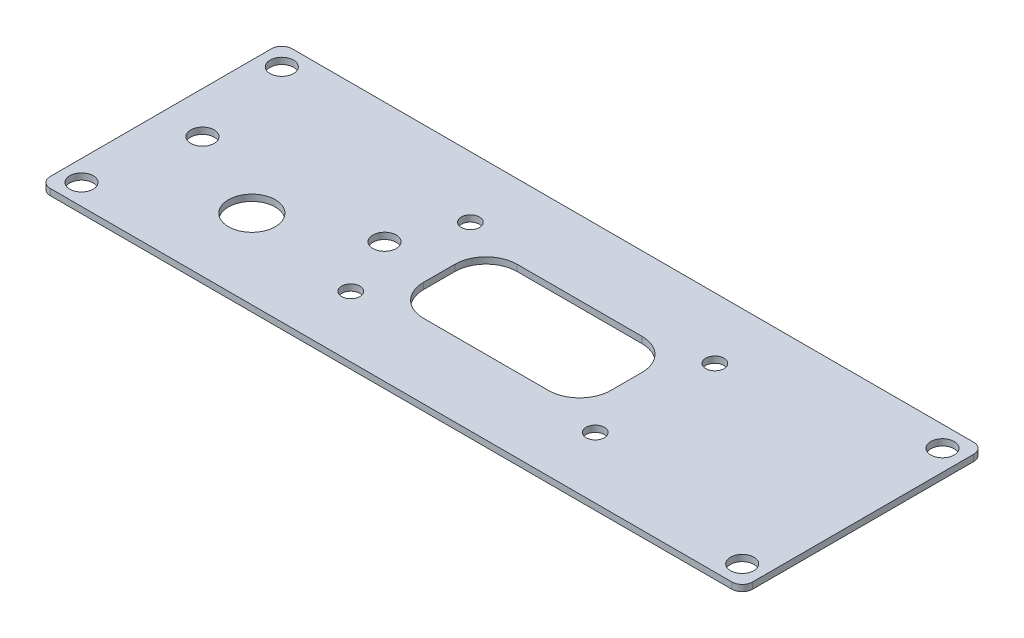
ISO-10303-21;
HEADER;
FILE_DESCRIPTION(('STEP AP214'),'2;1');
FILE_NAME('part.step','',(''),(''),'','','');
FILE_SCHEMA(('AUTOMOTIVE_DESIGN { 1 0 10303 214 1 1 1 1 }'));
ENDSEC;
DATA;
#1=APPLICATION_CONTEXT('core data for automotive mechanical design processes');
#2=APPLICATION_PROTOCOL_DEFINITION('international standard','automotive_design',2000,#1);
#3=PRODUCT_CONTEXT('',#1,'mechanical');
#4=PRODUCT('Part','Part','',(#3));
#5=PRODUCT_RELATED_PRODUCT_CATEGORY('part','',(#4));
#6=PRODUCT_DEFINITION_FORMATION('','',#4);
#7=PRODUCT_DEFINITION_CONTEXT('part definition',#1,'design');
#8=PRODUCT_DEFINITION('design','',#6,#7);
#9=PRODUCT_DEFINITION_SHAPE('','',#8);
#10=(LENGTH_UNIT() NAMED_UNIT(*) SI_UNIT(.MILLI.,.METRE.));
#11=(NAMED_UNIT(*) PLANE_ANGLE_UNIT() SI_UNIT($,.RADIAN.));
#12=(NAMED_UNIT(*) SI_UNIT($,.STERADIAN.) SOLID_ANGLE_UNIT());
#13=UNCERTAINTY_MEASURE_WITH_UNIT(LENGTH_MEASURE(1.E-05),#10,'distance_accuracy_value','');
#14=(GEOMETRIC_REPRESENTATION_CONTEXT(3) GLOBAL_UNCERTAINTY_ASSIGNED_CONTEXT((#13)) GLOBAL_UNIT_ASSIGNED_CONTEXT((#10,
#11,#12)) REPRESENTATION_CONTEXT('',''));
#15=CARTESIAN_POINT('',(0.,0.,0.));
#16=DIRECTION('',(0.,0.,1.));
#17=DIRECTION('',(1.,0.,0.));
#18=AXIS2_PLACEMENT_3D('',#15,#16,#17);
#19=CARTESIAN_POINT('',(65.5,1.2192,21.25));
#20=DIRECTION('',(0.,-1.,0.));
#21=DIRECTION('',(0.,0.,-1.));
#22=AXIS2_PLACEMENT_3D('',#19,#20,#21);
#23=PLANE('',#22);
#24=CARTESIAN_POINT('',(-42.,1.2192,8.));
#25=DIRECTION('',(0.,1.,0.));
#26=DIRECTION('',(0.,0.,1.));
#27=AXIS2_PLACEMENT_3D('',#24,#25,#26);
#28=CIRCLE('',#27,4.5);
#29=CARTESIAN_POINT('',(-42.,1.2192,12.5));
#30=VERTEX_POINT('',#29);
#31=EDGE_CURVE('E212',#30,#30,#28,.T.);
#32=ORIENTED_EDGE('',*,*,#31,.F.);
#33=EDGE_LOOP('',(#32));
#34=FACE_BOUND('',#33,.T.);
#35=CARTESIAN_POINT('',(-19.5,1.2192,11.5));
#36=DIRECTION('',(0.,1.,0.));
#37=DIRECTION('',(0.,0.,1.));
#38=AXIS2_PLACEMENT_3D('',#35,#36,#37);
#39=CIRCLE('',#38,1.75);
#40=CARTESIAN_POINT('',(-19.5,1.2192,13.25));
#41=VERTEX_POINT('',#40);
#42=EDGE_CURVE('E218',#41,#41,#39,.T.);
#43=ORIENTED_EDGE('',*,*,#42,.F.);
#44=EDGE_LOOP('',(#43));
#45=FACE_BOUND('',#44,.T.);
#46=CARTESIAN_POINT('',(27.5,1.2192,11.5));
#47=DIRECTION('',(0.,1.,0.));
#48=DIRECTION('',(0.,0.,1.));
#49=AXIS2_PLACEMENT_3D('',#46,#47,#48);
#50=CIRCLE('',#49,1.75);
#51=CARTESIAN_POINT('',(27.5,1.2192,13.25));
#52=VERTEX_POINT('',#51);
#53=EDGE_CURVE('E224',#52,#52,#50,.T.);
#54=ORIENTED_EDGE('',*,*,#53,.F.);
#55=EDGE_LOOP('',(#54));
#56=FACE_BOUND('',#55,.T.);
#57=CARTESIAN_POINT('',(-19.5,1.2192,-11.5));
#58=DIRECTION('',(0.,1.,0.));
#59=DIRECTION('',(0.,0.,1.));
#60=AXIS2_PLACEMENT_3D('',#57,#58,#59);
#61=CIRCLE('',#60,1.75);
#62=CARTESIAN_POINT('',(-19.5,1.2192,-9.75));
#63=VERTEX_POINT('',#62);
#64=EDGE_CURVE('E230',#63,#63,#61,.T.);
#65=ORIENTED_EDGE('',*,*,#64,.F.);
#66=EDGE_LOOP('',(#65));
#67=FACE_BOUND('',#66,.T.);
#68=CARTESIAN_POINT('',(27.5,1.2192,-11.5));
#69=DIRECTION('',(0.,1.,0.));
#70=DIRECTION('',(0.,0.,1.));
#71=AXIS2_PLACEMENT_3D('',#68,#69,#70);
#72=CIRCLE('',#71,1.75);
#73=CARTESIAN_POINT('',(27.5,1.2192,-9.75));
#74=VERTEX_POINT('',#73);
#75=EDGE_CURVE('E236',#74,#74,#72,.T.);
#76=ORIENTED_EDGE('',*,*,#75,.F.);
#77=EDGE_LOOP('',(#76));
#78=FACE_BOUND('',#77,.T.);
#79=CARTESIAN_POINT('',(63.5,1.2192,-19.25));
#80=DIRECTION('',(0.,1.,0.));
#81=DIRECTION('',(0.,0.,1.));
#82=AXIS2_PLACEMENT_3D('',#79,#80,#81);
#83=CIRCLE('',#82,2.25);
#84=CARTESIAN_POINT('',(63.5,1.2192,-17.));
#85=VERTEX_POINT('',#84);
#86=EDGE_CURVE('E242',#85,#85,#83,.T.);
#87=ORIENTED_EDGE('',*,*,#86,.F.);
#88=EDGE_LOOP('',(#87));
#89=FACE_BOUND('',#88,.T.);
#90=CARTESIAN_POINT('',(-63.5,1.2192,-19.25));
#91=DIRECTION('',(0.,1.,0.));
#92=DIRECTION('',(0.,0.,1.));
#93=AXIS2_PLACEMENT_3D('',#90,#91,#92);
#94=CIRCLE('',#93,2.25);
#95=CARTESIAN_POINT('',(-63.5,1.2192,-17.));
#96=VERTEX_POINT('',#95);
#97=EDGE_CURVE('E248',#96,#96,#94,.T.);
#98=ORIENTED_EDGE('',*,*,#97,.F.);
#99=EDGE_LOOP('',(#98));
#100=FACE_BOUND('',#99,.T.);
#101=CARTESIAN_POINT('',(63.5,1.2192,19.25));
#102=DIRECTION('',(0.,1.,0.));
#103=DIRECTION('',(0.,0.,1.));
#104=AXIS2_PLACEMENT_3D('',#101,#102,#103);
#105=CIRCLE('',#104,2.25);
#106=CARTESIAN_POINT('',(63.5,1.2192,21.5));
#107=VERTEX_POINT('',#106);
#108=EDGE_CURVE('E254',#107,#107,#105,.T.);
#109=ORIENTED_EDGE('',*,*,#108,.F.);
#110=EDGE_LOOP('',(#109));
#111=FACE_BOUND('',#110,.T.);
#112=CARTESIAN_POINT('',(-63.5,1.2192,19.25));
#113=DIRECTION('',(0.,1.,0.));
#114=DIRECTION('',(0.,0.,1.));
#115=AXIS2_PLACEMENT_3D('',#112,#113,#114);
#116=CIRCLE('',#115,2.25);
#117=CARTESIAN_POINT('',(-63.5,1.2192,21.5));
#118=VERTEX_POINT('',#117);
#119=EDGE_CURVE('E260',#118,#118,#116,.T.);
#120=ORIENTED_EDGE('',*,*,#119,.F.);
#121=EDGE_LOOP('',(#120));
#122=FACE_BOUND('',#121,.T.);
#123=CARTESIAN_POINT('',(-24.5,1.2192,0.));
#124=DIRECTION('',(0.,1.,0.));
#125=DIRECTION('',(0.,0.,1.));
#126=AXIS2_PLACEMENT_3D('',#123,#124,#125);
#127=CIRCLE('',#126,2.25);
#128=CARTESIAN_POINT('',(-24.5,1.2192,2.25));
#129=VERTEX_POINT('',#128);
#130=EDGE_CURVE('E266',#129,#129,#127,.T.);
#131=ORIENTED_EDGE('',*,*,#130,.F.);
#132=EDGE_LOOP('',(#131));
#133=FACE_BOUND('',#132,.T.);
#134=CARTESIAN_POINT('',(-59.5,1.2192,0.));
#135=DIRECTION('',(0.,1.,0.));
#136=DIRECTION('',(0.,0.,1.));
#137=AXIS2_PLACEMENT_3D('',#134,#135,#136);
#138=CIRCLE('',#137,2.25);
#139=CARTESIAN_POINT('',(-59.5,1.2192,2.25));
#140=VERTEX_POINT('',#139);
#141=EDGE_CURVE('E272',#140,#140,#138,.T.);
#142=ORIENTED_EDGE('',*,*,#141,.F.);
#143=EDGE_LOOP('',(#142));
#144=FACE_BOUND('',#143,.T.);
#145=CARTESIAN_POINT('',(65.5,1.2192,21.25));
#146=DIRECTION('',(0.,1.,0.));
#147=DIRECTION('',(0.,0.,-1.));
#148=AXIS2_PLACEMENT_3D('',#145,#146,#147);
#149=CIRCLE('',#148,2.);
#150=CARTESIAN_POINT('',(65.5,1.2192,23.25));
#151=VERTEX_POINT('',#150);
#152=CARTESIAN_POINT('',(67.5,1.2192,21.25));
#153=VERTEX_POINT('',#152);
#154=EDGE_CURVE('E278',#151,#153,#149,.T.);
#155=ORIENTED_EDGE('',*,*,#154,.T.);
#156=DIRECTION('',(0.,0.,-1.));
#157=VECTOR('',#156,1.);
#158=CARTESIAN_POINT('',(67.5,1.2192,21.25));
#159=LINE('',#158,#157);
#160=CARTESIAN_POINT('',(67.5,1.2192,-21.25));
#161=VERTEX_POINT('',#160);
#162=EDGE_CURVE('E281',#153,#161,#159,.T.);
#163=ORIENTED_EDGE('',*,*,#162,.T.);
#164=CARTESIAN_POINT('',(65.5,1.2192,-21.25));
#165=DIRECTION('',(0.,1.,0.));
#166=DIRECTION('',(0.,0.,-1.));
#167=AXIS2_PLACEMENT_3D('',#164,#165,#166);
#168=CIRCLE('',#167,2.);
#169=CARTESIAN_POINT('',(65.5,1.2192,-23.25));
#170=VERTEX_POINT('',#169);
#171=EDGE_CURVE('E284',#161,#170,#168,.T.);
#172=ORIENTED_EDGE('',*,*,#171,.T.);
#173=DIRECTION('',(-1.,0.,0.));
#174=VECTOR('',#173,1.);
#175=CARTESIAN_POINT('',(65.5,1.2192,-23.25));
#176=LINE('',#175,#174);
#177=CARTESIAN_POINT('',(-65.5,1.2192,-23.25));
#178=VERTEX_POINT('',#177);
#179=EDGE_CURVE('E286',#170,#178,#176,.T.);
#180=ORIENTED_EDGE('',*,*,#179,.T.);
#181=CARTESIAN_POINT('',(-65.5,1.2192,-21.25));
#182=DIRECTION('',(0.,1.,0.));
#183=DIRECTION('',(0.,0.,1.));
#184=AXIS2_PLACEMENT_3D('',#181,#182,#183);
#185=CIRCLE('',#184,2.);
#186=CARTESIAN_POINT('',(-67.5,1.2192,-21.25));
#187=VERTEX_POINT('',#186);
#188=EDGE_CURVE('E288',#178,#187,#185,.T.);
#189=ORIENTED_EDGE('',*,*,#188,.T.);
#190=DIRECTION('',(0.,0.,1.));
#191=VECTOR('',#190,1.);
#192=CARTESIAN_POINT('',(-67.5,1.2192,21.25));
#193=LINE('',#192,#191);
#194=CARTESIAN_POINT('',(-67.5,1.2192,21.25));
#195=VERTEX_POINT('',#194);
#196=EDGE_CURVE('E290',#187,#195,#193,.T.);
#197=ORIENTED_EDGE('',*,*,#196,.T.);
#198=CARTESIAN_POINT('',(-65.5,1.2192,21.25));
#199=DIRECTION('',(0.,1.,0.));
#200=DIRECTION('',(0.,0.,-1.));
#201=AXIS2_PLACEMENT_3D('',#198,#199,#200);
#202=CIRCLE('',#201,2.);
#203=CARTESIAN_POINT('',(-65.5,1.2192,23.25));
#204=VERTEX_POINT('',#203);
#205=EDGE_CURVE('E292',#195,#204,#202,.T.);
#206=ORIENTED_EDGE('',*,*,#205,.T.);
#207=DIRECTION('',(1.,0.,0.));
#208=VECTOR('',#207,1.);
#209=CARTESIAN_POINT('',(65.5,1.2192,23.25));
#210=LINE('',#209,#208);
#211=EDGE_CURVE('E294',#204,#151,#210,.T.);
#212=ORIENTED_EDGE('',*,*,#211,.T.);
#213=EDGE_LOOP('',(#155,#163,#172,#180,#189,#197,#206,#212));
#214=FACE_BOUND('',#213,.T.);
#215=CARTESIAN_POINT('',(-8.00000000000002,1.2192,-3.));
#216=DIRECTION('',(0.,1.,0.));
#217=DIRECTION('',(0.,0.,-1.));
#218=AXIS2_PLACEMENT_3D('',#215,#216,#217);
#219=CIRCLE('',#218,6.);
#220=CARTESIAN_POINT('',(-8.00000000000002,1.2192,-9.));
#221=VERTEX_POINT('',#220);
#222=CARTESIAN_POINT('',(-14.,1.2192,-3.));
#223=VERTEX_POINT('',#222);
#224=EDGE_CURVE('E147',#221,#223,#219,.T.);
#225=ORIENTED_EDGE('',*,*,#224,.F.);
#226=DIRECTION('',(-1.,0.,0.));
#227=VECTOR('',#226,1.);
#228=CARTESIAN_POINT('',(-8.00000000000002,1.2192,-9.));
#229=LINE('',#228,#227);
#230=CARTESIAN_POINT('',(16.,1.2192,-9.));
#231=VERTEX_POINT('',#230);
#232=EDGE_CURVE('E180',#231,#221,#229,.T.);
#233=ORIENTED_EDGE('',*,*,#232,.F.);
#234=CARTESIAN_POINT('',(16.,1.2192,-3.));
#235=DIRECTION('',(0.,1.,0.));
#236=DIRECTION('',(0.,0.,1.));
#237=AXIS2_PLACEMENT_3D('',#234,#235,#236);
#238=CIRCLE('',#237,6.);
#239=CARTESIAN_POINT('',(22.,1.2192,-3.));
#240=VERTEX_POINT('',#239);
#241=EDGE_CURVE('E178',#240,#231,#238,.T.);
#242=ORIENTED_EDGE('',*,*,#241,.F.);
#243=DIRECTION('',(0.,0.,-1.));
#244=VECTOR('',#243,1.);
#245=CARTESIAN_POINT('',(22.,1.2192,3.));
#246=LINE('',#245,#244);
#247=CARTESIAN_POINT('',(22.,1.2192,3.));
#248=VERTEX_POINT('',#247);
#249=EDGE_CURVE('E176',#248,#240,#246,.T.);
#250=ORIENTED_EDGE('',*,*,#249,.F.);
#251=CARTESIAN_POINT('',(16.,1.2192,3.));
#252=DIRECTION('',(0.,1.,0.));
#253=DIRECTION('',(0.,0.,1.));
#254=AXIS2_PLACEMENT_3D('',#251,#252,#253);
#255=CIRCLE('',#254,6.);
#256=CARTESIAN_POINT('',(16.,1.2192,9.));
#257=VERTEX_POINT('',#256);
#258=EDGE_CURVE('E174',#257,#248,#255,.T.);
#259=ORIENTED_EDGE('',*,*,#258,.F.);
#260=DIRECTION('',(1.,0.,0.));
#261=VECTOR('',#260,1.);
#262=CARTESIAN_POINT('',(-8.00000000000002,1.2192,9.));
#263=LINE('',#262,#261);
#264=CARTESIAN_POINT('',(-8.00000000000002,1.2192,9.));
#265=VERTEX_POINT('',#264);
#266=EDGE_CURVE('E170',#265,#257,#263,.T.);
#267=ORIENTED_EDGE('',*,*,#266,.F.);
#268=CARTESIAN_POINT('',(-8.00000000000002,1.2192,3.));
#269=DIRECTION('',(0.,1.,0.));
#270=DIRECTION('',(0.,0.,-1.));
#271=AXIS2_PLACEMENT_3D('',#268,#269,#270);
#272=CIRCLE('',#271,6.);
#273=CARTESIAN_POINT('',(-14.,1.2192,3.));
#274=VERTEX_POINT('',#273);
#275=EDGE_CURVE('E168',#274,#265,#272,.T.);
#276=ORIENTED_EDGE('',*,*,#275,.F.);
#277=DIRECTION('',(0.,0.,1.));
#278=VECTOR('',#277,1.);
#279=CARTESIAN_POINT('',(-14.,1.2192,3.));
#280=LINE('',#279,#278);
#281=EDGE_CURVE('E155',#223,#274,#280,.T.);
#282=ORIENTED_EDGE('',*,*,#281,.F.);
#283=EDGE_LOOP('',(#225,#233,#242,#250,#259,#267,#276,#282));
#284=FACE_BOUND('',#283,.T.);
#285=ADVANCED_FACE('F34',(#34,#45,#56,#67,#78,#89,#100,#111,#122,#133,#144,#214,#284),#23,.F.);
#286=CARTESIAN_POINT('',(65.5,0.,21.25));
#287=DIRECTION('',(0.,-1.,0.));
#288=DIRECTION('',(0.,0.,-1.));
#289=AXIS2_PLACEMENT_3D('',#286,#287,#288);
#290=PLANE('',#289);
#291=CARTESIAN_POINT('',(-19.5,0.,11.5));
#292=DIRECTION('',(0.,1.,0.));
#293=DIRECTION('',(0.,0.,1.));
#294=AXIS2_PLACEMENT_3D('',#291,#292,#293);
#295=CIRCLE('',#294,1.75);
#296=CARTESIAN_POINT('',(-19.5,0.,13.25));
#297=VERTEX_POINT('',#296);
#298=EDGE_CURVE('E215',#297,#297,#295,.T.);
#299=ORIENTED_EDGE('',*,*,#298,.T.);
#300=EDGE_LOOP('',(#299));
#301=FACE_BOUND('',#300,.T.);
#302=CARTESIAN_POINT('',(-19.5,0.,-11.5));
#303=DIRECTION('',(0.,1.,0.));
#304=DIRECTION('',(0.,0.,1.));
#305=AXIS2_PLACEMENT_3D('',#302,#303,#304);
#306=CIRCLE('',#305,1.75);
#307=CARTESIAN_POINT('',(-19.5,0.,-9.75));
#308=VERTEX_POINT('',#307);
#309=EDGE_CURVE('E227',#308,#308,#306,.T.);
#310=ORIENTED_EDGE('',*,*,#309,.T.);
#311=EDGE_LOOP('',(#310));
#312=FACE_BOUND('',#311,.T.);
#313=CARTESIAN_POINT('',(63.5,0.,-19.25));
#314=DIRECTION('',(0.,1.,0.));
#315=DIRECTION('',(0.,0.,1.));
#316=AXIS2_PLACEMENT_3D('',#313,#314,#315);
#317=CIRCLE('',#316,2.25);
#318=CARTESIAN_POINT('',(63.5,0.,-17.));
#319=VERTEX_POINT('',#318);
#320=EDGE_CURVE('E239',#319,#319,#317,.T.);
#321=ORIENTED_EDGE('',*,*,#320,.T.);
#322=EDGE_LOOP('',(#321));
#323=FACE_BOUND('',#322,.T.);
#324=CARTESIAN_POINT('',(63.5,0.,19.25));
#325=DIRECTION('',(0.,1.,0.));
#326=DIRECTION('',(0.,0.,1.));
#327=AXIS2_PLACEMENT_3D('',#324,#325,#326);
#328=CIRCLE('',#327,2.25);
#329=CARTESIAN_POINT('',(63.5,0.,21.5));
#330=VERTEX_POINT('',#329);
#331=EDGE_CURVE('E251',#330,#330,#328,.T.);
#332=ORIENTED_EDGE('',*,*,#331,.T.);
#333=EDGE_LOOP('',(#332));
#334=FACE_BOUND('',#333,.T.);
#335=CARTESIAN_POINT('',(-24.5,0.,0.));
#336=DIRECTION('',(0.,1.,0.));
#337=DIRECTION('',(0.,0.,1.));
#338=AXIS2_PLACEMENT_3D('',#335,#336,#337);
#339=CIRCLE('',#338,2.25);
#340=CARTESIAN_POINT('',(-24.5,0.,2.25));
#341=VERTEX_POINT('',#340);
#342=EDGE_CURVE('E263',#341,#341,#339,.T.);
#343=ORIENTED_EDGE('',*,*,#342,.T.);
#344=EDGE_LOOP('',(#343));
#345=FACE_BOUND('',#344,.T.);
#346=CARTESIAN_POINT('',(65.5,0.,21.25));
#347=DIRECTION('',(0.,1.,0.));
#348=DIRECTION('',(0.,0.,-1.));
#349=AXIS2_PLACEMENT_3D('',#346,#347,#348);
#350=CIRCLE('',#349,2.);
#351=CARTESIAN_POINT('',(65.5,0.,23.25));
#352=VERTEX_POINT('',#351);
#353=CARTESIAN_POINT('',(67.5,0.,21.25));
#354=VERTEX_POINT('',#353);
#355=EDGE_CURVE('E275',#352,#354,#350,.T.);
#356=ORIENTED_EDGE('',*,*,#355,.F.);
#357=DIRECTION('',(1.,0.,0.));
#358=VECTOR('',#357,1.);
#359=CARTESIAN_POINT('',(65.5,0.,23.25));
#360=LINE('',#359,#358);
#361=CARTESIAN_POINT('',(-65.5,0.,23.25));
#362=VERTEX_POINT('',#361);
#363=EDGE_CURVE('E282',#362,#352,#360,.T.);
#364=ORIENTED_EDGE('',*,*,#363,.F.);
#365=CARTESIAN_POINT('',(-65.5,0.,21.25));
#366=DIRECTION('',(0.,1.,0.));
#367=DIRECTION('',(0.,0.,-1.));
#368=AXIS2_PLACEMENT_3D('',#365,#366,#367);
#369=CIRCLE('',#368,2.);
#370=CARTESIAN_POINT('',(-67.5,0.,21.25));
#371=VERTEX_POINT('',#370);
#372=EDGE_CURVE('E309',#371,#362,#369,.T.);
#373=ORIENTED_EDGE('',*,*,#372,.F.);
#374=DIRECTION('',(0.,0.,1.));
#375=VECTOR('',#374,1.);
#376=CARTESIAN_POINT('',(-67.5,0.,21.25));
#377=LINE('',#376,#375);
#378=CARTESIAN_POINT('',(-67.5,0.,-21.25));
#379=VERTEX_POINT('',#378);
#380=EDGE_CURVE('E307',#379,#371,#377,.T.);
#381=ORIENTED_EDGE('',*,*,#380,.F.);
#382=CARTESIAN_POINT('',(-65.5,0.,-21.25));
#383=DIRECTION('',(0.,1.,0.));
#384=DIRECTION('',(0.,0.,1.));
#385=AXIS2_PLACEMENT_3D('',#382,#383,#384);
#386=CIRCLE('',#385,2.);
#387=CARTESIAN_POINT('',(-65.5,0.,-23.25));
#388=VERTEX_POINT('',#387);
#389=EDGE_CURVE('E305',#388,#379,#386,.T.);
#390=ORIENTED_EDGE('',*,*,#389,.F.);
#391=DIRECTION('',(-1.,0.,0.));
#392=VECTOR('',#391,1.);
#393=CARTESIAN_POINT('',(65.5,0.,-23.25));
#394=LINE('',#393,#392);
#395=CARTESIAN_POINT('',(65.5,0.,-23.25));
#396=VERTEX_POINT('',#395);
#397=EDGE_CURVE('E303',#396,#388,#394,.T.);
#398=ORIENTED_EDGE('',*,*,#397,.F.);
#399=CARTESIAN_POINT('',(65.5,0.,-21.25));
#400=DIRECTION('',(0.,1.,0.));
#401=DIRECTION('',(0.,0.,-1.));
#402=AXIS2_PLACEMENT_3D('',#399,#400,#401);
#403=CIRCLE('',#402,2.);
#404=CARTESIAN_POINT('',(67.5,0.,-21.25));
#405=VERTEX_POINT('',#404);
#406=EDGE_CURVE('E301',#405,#396,#403,.T.);
#407=ORIENTED_EDGE('',*,*,#406,.F.);
#408=DIRECTION('',(0.,0.,-1.));
#409=VECTOR('',#408,1.);
#410=CARTESIAN_POINT('',(67.5,0.,21.25));
#411=LINE('',#410,#409);
#412=EDGE_CURVE('E299',#354,#405,#411,.T.);
#413=ORIENTED_EDGE('',*,*,#412,.F.);
#414=EDGE_LOOP('',(#356,#364,#373,#381,#390,#398,#407,#413));
#415=FACE_BOUND('',#414,.T.);
#416=CARTESIAN_POINT('',(-59.5,0.,0.));
#417=DIRECTION('',(0.,1.,0.));
#418=DIRECTION('',(0.,0.,1.));
#419=AXIS2_PLACEMENT_3D('',#416,#417,#418);
#420=CIRCLE('',#419,2.25);
#421=CARTESIAN_POINT('',(-59.5,0.,2.25));
#422=VERTEX_POINT('',#421);
#423=EDGE_CURVE('E269',#422,#422,#420,.T.);
#424=ORIENTED_EDGE('',*,*,#423,.T.);
#425=EDGE_LOOP('',(#424));
#426=FACE_BOUND('',#425,.T.);
#427=CARTESIAN_POINT('',(-63.5,0.,19.25));
#428=DIRECTION('',(0.,1.,0.));
#429=DIRECTION('',(0.,0.,1.));
#430=AXIS2_PLACEMENT_3D('',#427,#428,#429);
#431=CIRCLE('',#430,2.25);
#432=CARTESIAN_POINT('',(-63.5,0.,21.5));
#433=VERTEX_POINT('',#432);
#434=EDGE_CURVE('E257',#433,#433,#431,.T.);
#435=ORIENTED_EDGE('',*,*,#434,.T.);
#436=EDGE_LOOP('',(#435));
#437=FACE_BOUND('',#436,.T.);
#438=CARTESIAN_POINT('',(-63.5,0.,-19.25));
#439=DIRECTION('',(0.,1.,0.));
#440=DIRECTION('',(0.,0.,1.));
#441=AXIS2_PLACEMENT_3D('',#438,#439,#440);
#442=CIRCLE('',#441,2.25);
#443=CARTESIAN_POINT('',(-63.5,0.,-17.));
#444=VERTEX_POINT('',#443);
#445=EDGE_CURVE('E245',#444,#444,#442,.T.);
#446=ORIENTED_EDGE('',*,*,#445,.T.);
#447=EDGE_LOOP('',(#446));
#448=FACE_BOUND('',#447,.T.);
#449=CARTESIAN_POINT('',(27.5,0.,-11.5));
#450=DIRECTION('',(0.,1.,0.));
#451=DIRECTION('',(0.,0.,1.));
#452=AXIS2_PLACEMENT_3D('',#449,#450,#451);
#453=CIRCLE('',#452,1.75);
#454=CARTESIAN_POINT('',(27.5,0.,-9.75));
#455=VERTEX_POINT('',#454);
#456=EDGE_CURVE('E233',#455,#455,#453,.T.);
#457=ORIENTED_EDGE('',*,*,#456,.T.);
#458=EDGE_LOOP('',(#457));
#459=FACE_BOUND('',#458,.T.);
#460=CARTESIAN_POINT('',(27.5,0.,11.5));
#461=DIRECTION('',(0.,1.,0.));
#462=DIRECTION('',(0.,0.,1.));
#463=AXIS2_PLACEMENT_3D('',#460,#461,#462);
#464=CIRCLE('',#463,1.75);
#465=CARTESIAN_POINT('',(27.5,0.,13.25));
#466=VERTEX_POINT('',#465);
#467=EDGE_CURVE('E221',#466,#466,#464,.T.);
#468=ORIENTED_EDGE('',*,*,#467,.T.);
#469=EDGE_LOOP('',(#468));
#470=FACE_BOUND('',#469,.T.);
#471=CARTESIAN_POINT('',(-42.,0.,8.));
#472=DIRECTION('',(0.,1.,0.));
#473=DIRECTION('',(0.,0.,1.));
#474=AXIS2_PLACEMENT_3D('',#471,#472,#473);
#475=CIRCLE('',#474,4.5);
#476=CARTESIAN_POINT('',(-42.,0.,12.5));
#477=VERTEX_POINT('',#476);
#478=EDGE_CURVE('E163',#477,#477,#475,.T.);
#479=ORIENTED_EDGE('',*,*,#478,.T.);
#480=EDGE_LOOP('',(#479));
#481=FACE_BOUND('',#480,.T.);
#482=DIRECTION('',(-1.,0.,0.));
#483=VECTOR('',#482,1.);
#484=CARTESIAN_POINT('',(-8.00000000000002,0.,-9.));
#485=LINE('',#484,#483);
#486=CARTESIAN_POINT('',(16.,0.,-9.));
#487=VERTEX_POINT('',#486);
#488=CARTESIAN_POINT('',(-8.00000000000001,0.,-9.));
#489=VERTEX_POINT('',#488);
#490=EDGE_CURVE('E156',#487,#489,#485,.T.);
#491=ORIENTED_EDGE('',*,*,#490,.T.);
#492=CARTESIAN_POINT('',(-8.00000000000002,0.,-3.));
#493=DIRECTION('',(0.,1.,0.));
#494=DIRECTION('',(0.,0.,-1.));
#495=AXIS2_PLACEMENT_3D('',#492,#493,#494);
#496=CIRCLE('',#495,6.);
#497=CARTESIAN_POINT('',(-14.,0.,-3.));
#498=VERTEX_POINT('',#497);
#499=EDGE_CURVE('E57',#489,#498,#496,.T.);
#500=ORIENTED_EDGE('',*,*,#499,.T.);
#501=DIRECTION('',(0.,0.,1.));
#502=VECTOR('',#501,1.);
#503=CARTESIAN_POINT('',(-14.,0.,3.));
#504=LINE('',#503,#502);
#505=CARTESIAN_POINT('',(-14.,0.,3.));
#506=VERTEX_POINT('',#505);
#507=EDGE_CURVE('E162',#498,#506,#504,.T.);
#508=ORIENTED_EDGE('',*,*,#507,.T.);
#509=CARTESIAN_POINT('',(-8.00000000000002,0.,3.));
#510=DIRECTION('',(0.,1.,0.));
#511=DIRECTION('',(0.,0.,-1.));
#512=AXIS2_PLACEMENT_3D('',#509,#510,#511);
#513=CIRCLE('',#512,6.);
#514=CARTESIAN_POINT('',(-8.00000000000002,0.,9.));
#515=VERTEX_POINT('',#514);
#516=EDGE_CURVE('E184',#506,#515,#513,.T.);
#517=ORIENTED_EDGE('',*,*,#516,.T.);
#518=DIRECTION('',(1.,0.,0.));
#519=VECTOR('',#518,1.);
#520=CARTESIAN_POINT('',(-8.00000000000002,0.,9.));
#521=LINE('',#520,#519);
#522=CARTESIAN_POINT('',(16.,0.,9.));
#523=VERTEX_POINT('',#522);
#524=EDGE_CURVE('E187',#515,#523,#521,.T.);
#525=ORIENTED_EDGE('',*,*,#524,.T.);
#526=CARTESIAN_POINT('',(16.,0.,3.));
#527=DIRECTION('',(0.,1.,0.));
#528=DIRECTION('',(0.,0.,1.));
#529=AXIS2_PLACEMENT_3D('',#526,#527,#528);
#530=CIRCLE('',#529,6.);
#531=CARTESIAN_POINT('',(22.,0.,3.));
#532=VERTEX_POINT('',#531);
#533=EDGE_CURVE('E190',#523,#532,#530,.T.);
#534=ORIENTED_EDGE('',*,*,#533,.T.);
#535=DIRECTION('',(0.,0.,-1.));
#536=VECTOR('',#535,1.);
#537=CARTESIAN_POINT('',(22.,0.,3.));
#538=LINE('',#537,#536);
#539=CARTESIAN_POINT('',(22.,0.,-3.));
#540=VERTEX_POINT('',#539);
#541=EDGE_CURVE('E193',#532,#540,#538,.T.);
#542=ORIENTED_EDGE('',*,*,#541,.T.);
#543=CARTESIAN_POINT('',(16.,0.,-3.));
#544=DIRECTION('',(0.,1.,0.));
#545=DIRECTION('',(0.,0.,1.));
#546=AXIS2_PLACEMENT_3D('',#543,#544,#545);
#547=CIRCLE('',#546,6.);
#548=EDGE_CURVE('E196',#540,#487,#547,.T.);
#549=ORIENTED_EDGE('',*,*,#548,.T.);
#550=EDGE_LOOP('',(#491,#500,#508,#517,#525,#534,#542,#549));
#551=FACE_BOUND('',#550,.T.);
#552=ADVANCED_FACE('F339',(#301,#312,#323,#334,#345,#415,#426,#437,#448,#459,#470,#481,#551),
#290,.T.);
#553=CARTESIAN_POINT('',(65.5,1.2192,21.25));
#554=DIRECTION('',(0.,-1.,0.));
#555=DIRECTION('',(0.,0.,-1.));
#556=AXIS2_PLACEMENT_3D('',#553,#554,#555);
#557=CYLINDRICAL_SURFACE('',#556,2.);
#558=ORIENTED_EDGE('',*,*,#355,.T.);
#559=DIRECTION('',(0.,-1.,0.));
#560=VECTOR('',#559,1.);
#561=CARTESIAN_POINT('',(67.5,1.2192,21.25));
#562=LINE('',#561,#560);
#563=EDGE_CURVE('E11',#153,#354,#562,.T.);
#564=ORIENTED_EDGE('',*,*,#563,.F.);
#565=ORIENTED_EDGE('',*,*,#154,.F.);
#566=DIRECTION('',(0.,-1.,0.));
#567=VECTOR('',#566,1.);
#568=CARTESIAN_POINT('',(65.5,1.2192,23.25));
#569=LINE('',#568,#567);
#570=EDGE_CURVE('E296',#151,#352,#569,.T.);
#571=ORIENTED_EDGE('',*,*,#570,.T.);
#572=EDGE_LOOP('',(#558,#564,#565,#571));
#573=FACE_BOUND('',#572,.T.);
#574=ADVANCED_FACE('F36',(#573),#557,.T.);
#575=CARTESIAN_POINT('',(67.5,1.2192,21.25));
#576=DIRECTION('',(-1.,0.,0.));
#577=DIRECTION('',(0.,0.,1.));
#578=AXIS2_PLACEMENT_3D('',#575,#576,#577);
#579=PLANE('',#578);
#580=ORIENTED_EDGE('',*,*,#412,.T.);
#581=DIRECTION('',(0.,-1.,0.));
#582=VECTOR('',#581,1.);
#583=CARTESIAN_POINT('',(67.5,1.2192,-21.25));
#584=LINE('',#583,#582);
#585=EDGE_CURVE('E42',#161,#405,#584,.T.);
#586=ORIENTED_EDGE('',*,*,#585,.F.);
#587=ORIENTED_EDGE('',*,*,#162,.F.);
#588=ORIENTED_EDGE('',*,*,#563,.T.);
#589=EDGE_LOOP('',(#580,#586,#587,#588));
#590=FACE_BOUND('',#589,.T.);
#591=ADVANCED_FACE('F356',(#590),#579,.F.);
#592=CARTESIAN_POINT('',(65.5,1.2192,-21.25));
#593=DIRECTION('',(0.,-1.,0.));
#594=DIRECTION('',(0.,0.,-1.));
#595=AXIS2_PLACEMENT_3D('',#592,#593,#594);
#596=CYLINDRICAL_SURFACE('',#595,2.);
#597=ORIENTED_EDGE('',*,*,#406,.T.);
#598=DIRECTION('',(0.,-1.,0.));
#599=VECTOR('',#598,1.);
#600=CARTESIAN_POINT('',(65.5,1.2192,-23.25));
#601=LINE('',#600,#599);
#602=EDGE_CURVE('E326',#170,#396,#601,.T.);
#603=ORIENTED_EDGE('',*,*,#602,.F.);
#604=ORIENTED_EDGE('',*,*,#171,.F.);
#605=ORIENTED_EDGE('',*,*,#585,.T.);
#606=EDGE_LOOP('',(#597,#603,#604,#605));
#607=FACE_BOUND('',#606,.T.);
#608=ADVANCED_FACE('F333',(#607),#596,.T.);
#609=CARTESIAN_POINT('',(65.5,1.2192,-23.25));
#610=DIRECTION('',(0.,0.,1.));
#611=DIRECTION('',(1.,0.,0.));
#612=AXIS2_PLACEMENT_3D('',#609,#610,#611);
#613=PLANE('',#612);
#614=ORIENTED_EDGE('',*,*,#397,.T.);
#615=DIRECTION('',(0.,-1.,0.));
#616=VECTOR('',#615,1.);
#617=CARTESIAN_POINT('',(-65.5,1.2192,-23.25));
#618=LINE('',#617,#616);
#619=EDGE_CURVE('E323',#178,#388,#618,.T.);
#620=ORIENTED_EDGE('',*,*,#619,.F.);
#621=ORIENTED_EDGE('',*,*,#179,.F.);
#622=ORIENTED_EDGE('',*,*,#602,.T.);
#623=EDGE_LOOP('',(#614,#620,#621,#622));
#624=FACE_BOUND('',#623,.T.);
#625=ADVANCED_FACE('F345',(#624),#613,.F.);
#626=CARTESIAN_POINT('',(-65.5,1.2192,-21.25));
#627=DIRECTION('',(0.,-1.,0.));
#628=DIRECTION('',(0.,0.,-1.));
#629=AXIS2_PLACEMENT_3D('',#626,#627,#628);
#630=CYLINDRICAL_SURFACE('',#629,2.);
#631=ORIENTED_EDGE('',*,*,#389,.T.);
#632=DIRECTION('',(0.,-1.,0.));
#633=VECTOR('',#632,1.);
#634=CARTESIAN_POINT('',(-67.5,1.2192,-21.25));
#635=LINE('',#634,#633);
#636=EDGE_CURVE('E320',#187,#379,#635,.T.);
#637=ORIENTED_EDGE('',*,*,#636,.F.);
#638=ORIENTED_EDGE('',*,*,#188,.F.);
#639=ORIENTED_EDGE('',*,*,#619,.T.);
#640=EDGE_LOOP('',(#631,#637,#638,#639));
#641=FACE_BOUND('',#640,.T.);
#642=ADVANCED_FACE('F349',(#641),#630,.T.);
#643=CARTESIAN_POINT('',(-67.5,1.2192,21.25));
#644=DIRECTION('',(1.,0.,0.));
#645=DIRECTION('',(0.,0.,-1.));
#646=AXIS2_PLACEMENT_3D('',#643,#644,#645);
#647=PLANE('',#646);
#648=ORIENTED_EDGE('',*,*,#380,.T.);
#649=DIRECTION('',(0.,-1.,0.));
#650=VECTOR('',#649,1.);
#651=CARTESIAN_POINT('',(-67.5,1.2192,21.25));
#652=LINE('',#651,#650);
#653=EDGE_CURVE('E317',#195,#371,#652,.T.);
#654=ORIENTED_EDGE('',*,*,#653,.F.);
#655=ORIENTED_EDGE('',*,*,#196,.F.);
#656=ORIENTED_EDGE('',*,*,#636,.T.);
#657=EDGE_LOOP('',(#648,#654,#655,#656));
#658=FACE_BOUND('',#657,.T.);
#659=ADVANCED_FACE('F369',(#658),#647,.F.);
#660=CARTESIAN_POINT('',(-65.5,1.2192,21.25));
#661=DIRECTION('',(0.,-1.,0.));
#662=DIRECTION('',(0.,0.,-1.));
#663=AXIS2_PLACEMENT_3D('',#660,#661,#662);
#664=CYLINDRICAL_SURFACE('',#663,2.);
#665=ORIENTED_EDGE('',*,*,#372,.T.);
#666=DIRECTION('',(0.,-1.,0.));
#667=VECTOR('',#666,1.);
#668=CARTESIAN_POINT('',(-65.5,1.2192,23.25));
#669=LINE('',#668,#667);
#670=EDGE_CURVE('E314',#204,#362,#669,.T.);
#671=ORIENTED_EDGE('',*,*,#670,.F.);
#672=ORIENTED_EDGE('',*,*,#205,.F.);
#673=ORIENTED_EDGE('',*,*,#653,.T.);
#674=EDGE_LOOP('',(#665,#671,#672,#673));
#675=FACE_BOUND('',#674,.T.);
#676=ADVANCED_FACE('F367',(#675),#664,.T.);
#677=CARTESIAN_POINT('',(65.5,1.2192,23.25));
#678=DIRECTION('',(0.,0.,-1.));
#679=DIRECTION('',(-1.,0.,0.));
#680=AXIS2_PLACEMENT_3D('',#677,#678,#679);
#681=PLANE('',#680);
#682=ORIENTED_EDGE('',*,*,#363,.T.);
#683=ORIENTED_EDGE('',*,*,#570,.F.);
#684=ORIENTED_EDGE('',*,*,#211,.F.);
#685=ORIENTED_EDGE('',*,*,#670,.T.);
#686=EDGE_LOOP('',(#682,#683,#684,#685));
#687=FACE_BOUND('',#686,.T.);
#688=ADVANCED_FACE('F362',(#687),#681,.F.);
#689=CARTESIAN_POINT('',(-59.5,1.2192,0.));
#690=DIRECTION('',(0.,-1.,0.));
#691=DIRECTION('',(0.,0.,-1.));
#692=AXIS2_PLACEMENT_3D('',#689,#690,#691);
#693=CYLINDRICAL_SURFACE('',#692,2.25);
#694=ORIENTED_EDGE('',*,*,#141,.T.);
#695=EDGE_LOOP('',(#694));
#696=FACE_BOUND('',#695,.T.);
#697=ORIENTED_EDGE('',*,*,#423,.F.);
#698=EDGE_LOOP('',(#697));
#699=FACE_BOUND('',#698,.T.);
#700=ADVANCED_FACE('F389',(#696,#699),#693,.F.);
#701=CARTESIAN_POINT('',(-24.5,1.2192,0.));
#702=DIRECTION('',(0.,-1.,0.));
#703=DIRECTION('',(0.,0.,-1.));
#704=AXIS2_PLACEMENT_3D('',#701,#702,#703);
#705=CYLINDRICAL_SURFACE('',#704,2.25);
#706=ORIENTED_EDGE('',*,*,#130,.T.);
#707=EDGE_LOOP('',(#706));
#708=FACE_BOUND('',#707,.T.);
#709=ORIENTED_EDGE('',*,*,#342,.F.);
#710=EDGE_LOOP('',(#709));
#711=FACE_BOUND('',#710,.T.);
#712=ADVANCED_FACE('F396',(#708,#711),#705,.F.);
#713=CARTESIAN_POINT('',(-63.5,1.2192,19.25));
#714=DIRECTION('',(0.,-1.,0.));
#715=DIRECTION('',(0.,0.,-1.));
#716=AXIS2_PLACEMENT_3D('',#713,#714,#715);
#717=CYLINDRICAL_SURFACE('',#716,2.25);
#718=ORIENTED_EDGE('',*,*,#119,.T.);
#719=EDGE_LOOP('',(#718));
#720=FACE_BOUND('',#719,.T.);
#721=ORIENTED_EDGE('',*,*,#434,.F.);
#722=EDGE_LOOP('',(#721));
#723=FACE_BOUND('',#722,.T.);
#724=ADVANCED_FACE('F401',(#720,#723),#717,.F.);
#725=CARTESIAN_POINT('',(63.5,1.2192,19.25));
#726=DIRECTION('',(0.,-1.,0.));
#727=DIRECTION('',(0.,0.,-1.));
#728=AXIS2_PLACEMENT_3D('',#725,#726,#727);
#729=CYLINDRICAL_SURFACE('',#728,2.25);
#730=ORIENTED_EDGE('',*,*,#108,.T.);
#731=EDGE_LOOP('',(#730));
#732=FACE_BOUND('',#731,.T.);
#733=ORIENTED_EDGE('',*,*,#331,.F.);
#734=EDGE_LOOP('',(#733));
#735=FACE_BOUND('',#734,.T.);
#736=ADVANCED_FACE('F479',(#732,#735),#729,.F.);
#737=CARTESIAN_POINT('',(-63.5,1.2192,-19.25));
#738=DIRECTION('',(0.,-1.,0.));
#739=DIRECTION('',(0.,0.,-1.));
#740=AXIS2_PLACEMENT_3D('',#737,#738,#739);
#741=CYLINDRICAL_SURFACE('',#740,2.25);
#742=ORIENTED_EDGE('',*,*,#97,.T.);
#743=EDGE_LOOP('',(#742));
#744=FACE_BOUND('',#743,.T.);
#745=ORIENTED_EDGE('',*,*,#445,.F.);
#746=EDGE_LOOP('',(#745));
#747=FACE_BOUND('',#746,.T.);
#748=ADVANCED_FACE('F475',(#744,#747),#741,.F.);
#749=CARTESIAN_POINT('',(63.5,1.2192,-19.25));
#750=DIRECTION('',(0.,-1.,0.));
#751=DIRECTION('',(0.,0.,-1.));
#752=AXIS2_PLACEMENT_3D('',#749,#750,#751);
#753=CYLINDRICAL_SURFACE('',#752,2.25);
#754=ORIENTED_EDGE('',*,*,#86,.T.);
#755=EDGE_LOOP('',(#754));
#756=FACE_BOUND('',#755,.T.);
#757=ORIENTED_EDGE('',*,*,#320,.F.);
#758=EDGE_LOOP('',(#757));
#759=FACE_BOUND('',#758,.T.);
#760=ADVANCED_FACE('F471',(#756,#759),#753,.F.);
#761=CARTESIAN_POINT('',(27.5,1.2192,-11.5));
#762=DIRECTION('',(0.,-1.,0.));
#763=DIRECTION('',(0.,0.,-1.));
#764=AXIS2_PLACEMENT_3D('',#761,#762,#763);
#765=CYLINDRICAL_SURFACE('',#764,1.75);
#766=ORIENTED_EDGE('',*,*,#75,.T.);
#767=EDGE_LOOP('',(#766));
#768=FACE_BOUND('',#767,.T.);
#769=ORIENTED_EDGE('',*,*,#456,.F.);
#770=EDGE_LOOP('',(#769));
#771=FACE_BOUND('',#770,.T.);
#772=ADVANCED_FACE('F467',(#768,#771),#765,.F.);
#773=CARTESIAN_POINT('',(-19.5,1.2192,-11.5));
#774=DIRECTION('',(0.,-1.,0.));
#775=DIRECTION('',(0.,0.,-1.));
#776=AXIS2_PLACEMENT_3D('',#773,#774,#775);
#777=CYLINDRICAL_SURFACE('',#776,1.75);
#778=ORIENTED_EDGE('',*,*,#64,.T.);
#779=EDGE_LOOP('',(#778));
#780=FACE_BOUND('',#779,.T.);
#781=ORIENTED_EDGE('',*,*,#309,.F.);
#782=EDGE_LOOP('',(#781));
#783=FACE_BOUND('',#782,.T.);
#784=ADVANCED_FACE('F463',(#780,#783),#777,.F.);
#785=CARTESIAN_POINT('',(27.5,1.2192,11.5));
#786=DIRECTION('',(0.,-1.,0.));
#787=DIRECTION('',(0.,0.,-1.));
#788=AXIS2_PLACEMENT_3D('',#785,#786,#787);
#789=CYLINDRICAL_SURFACE('',#788,1.75);
#790=ORIENTED_EDGE('',*,*,#53,.T.);
#791=EDGE_LOOP('',(#790));
#792=FACE_BOUND('',#791,.T.);
#793=ORIENTED_EDGE('',*,*,#467,.F.);
#794=EDGE_LOOP('',(#793));
#795=FACE_BOUND('',#794,.T.);
#796=ADVANCED_FACE('F459',(#792,#795),#789,.F.);
#797=CARTESIAN_POINT('',(-19.5,1.2192,11.5));
#798=DIRECTION('',(0.,-1.,0.));
#799=DIRECTION('',(0.,0.,-1.));
#800=AXIS2_PLACEMENT_3D('',#797,#798,#799);
#801=CYLINDRICAL_SURFACE('',#800,1.75);
#802=ORIENTED_EDGE('',*,*,#42,.T.);
#803=EDGE_LOOP('',(#802));
#804=FACE_BOUND('',#803,.T.);
#805=ORIENTED_EDGE('',*,*,#298,.F.);
#806=EDGE_LOOP('',(#805));
#807=FACE_BOUND('',#806,.T.);
#808=ADVANCED_FACE('F455',(#804,#807),#801,.F.);
#809=CARTESIAN_POINT('',(-42.,1.2192,8.));
#810=DIRECTION('',(0.,-1.,0.));
#811=DIRECTION('',(0.,0.,-1.));
#812=AXIS2_PLACEMENT_3D('',#809,#810,#811);
#813=CYLINDRICAL_SURFACE('',#812,4.5);
#814=ORIENTED_EDGE('',*,*,#31,.T.);
#815=EDGE_LOOP('',(#814));
#816=FACE_BOUND('',#815,.T.);
#817=ORIENTED_EDGE('',*,*,#478,.F.);
#818=EDGE_LOOP('',(#817));
#819=FACE_BOUND('',#818,.T.);
#820=ADVANCED_FACE('F452',(#816,#819),#813,.F.);
#821=CARTESIAN_POINT('',(-8.00000000000002,1.2192,-3.));
#822=DIRECTION('',(0.,-1.,0.));
#823=DIRECTION('',(0.,0.,-1.));
#824=AXIS2_PLACEMENT_3D('',#821,#822,#823);
#825=CYLINDRICAL_SURFACE('',#824,6.);
#826=ORIENTED_EDGE('',*,*,#499,.F.);
#827=DIRECTION('',(0.,-1.,0.));
#828=VECTOR('',#827,1.);
#829=CARTESIAN_POINT('',(-8.00000000000002,1.2192,-9.));
#830=LINE('',#829,#828);
#831=EDGE_CURVE('E151',#221,#489,#830,.T.);
#832=ORIENTED_EDGE('',*,*,#831,.F.);
#833=ORIENTED_EDGE('',*,*,#224,.T.);
#834=DIRECTION('',(0.,-1.,0.));
#835=VECTOR('',#834,1.);
#836=CARTESIAN_POINT('',(-14.,1.2192,-3.));
#837=LINE('',#836,#835);
#838=EDGE_CURVE('E150',#223,#498,#837,.T.);
#839=ORIENTED_EDGE('',*,*,#838,.T.);
#840=EDGE_LOOP('',(#826,#832,#833,#839));
#841=FACE_BOUND('',#840,.T.);
#842=ADVANCED_FACE('F149',(#841),#825,.F.);
#843=CARTESIAN_POINT('',(-14.,1.2192,3.));
#844=DIRECTION('',(1.,0.,0.));
#845=DIRECTION('',(0.,0.,-1.));
#846=AXIS2_PLACEMENT_3D('',#843,#844,#845);
#847=PLANE('',#846);
#848=ORIENTED_EDGE('',*,*,#507,.F.);
#849=ORIENTED_EDGE('',*,*,#838,.F.);
#850=ORIENTED_EDGE('',*,*,#281,.T.);
#851=DIRECTION('',(0.,-1.,0.));
#852=VECTOR('',#851,1.);
#853=CARTESIAN_POINT('',(-14.,1.2192,3.));
#854=LINE('',#853,#852);
#855=EDGE_CURVE('E164',#274,#506,#854,.T.);
#856=ORIENTED_EDGE('',*,*,#855,.T.);
#857=EDGE_LOOP('',(#848,#849,#850,#856));
#858=FACE_BOUND('',#857,.T.);
#859=ADVANCED_FACE('F159',(#858),#847,.T.);
#860=CARTESIAN_POINT('',(-8.00000000000002,1.2192,3.));
#861=DIRECTION('',(0.,-1.,0.));
#862=DIRECTION('',(0.,0.,-1.));
#863=AXIS2_PLACEMENT_3D('',#860,#861,#862);
#864=CYLINDRICAL_SURFACE('',#863,6.);
#865=ORIENTED_EDGE('',*,*,#516,.F.);
#866=ORIENTED_EDGE('',*,*,#855,.F.);
#867=ORIENTED_EDGE('',*,*,#275,.T.);
#868=DIRECTION('',(0.,-1.,0.));
#869=VECTOR('',#868,1.);
#870=CARTESIAN_POINT('',(-8.00000000000002,1.2192,9.));
#871=LINE('',#870,#869);
#872=EDGE_CURVE('E209',#265,#515,#871,.T.);
#873=ORIENTED_EDGE('',*,*,#872,.T.);
#874=EDGE_LOOP('',(#865,#866,#867,#873));
#875=FACE_BOUND('',#874,.T.);
#876=ADVANCED_FACE('F439',(#875),#864,.F.);
#877=CARTESIAN_POINT('',(-8.00000000000002,1.2192,9.));
#878=DIRECTION('',(0.,0.,-1.));
#879=DIRECTION('',(-1.,0.,0.));
#880=AXIS2_PLACEMENT_3D('',#877,#878,#879);
#881=PLANE('',#880);
#882=ORIENTED_EDGE('',*,*,#524,.F.);
#883=ORIENTED_EDGE('',*,*,#872,.F.);
#884=ORIENTED_EDGE('',*,*,#266,.T.);
#885=DIRECTION('',(0.,-1.,0.));
#886=VECTOR('',#885,1.);
#887=CARTESIAN_POINT('',(16.,1.2192,9.));
#888=LINE('',#887,#886);
#889=EDGE_CURVE('E207',#257,#523,#888,.T.);
#890=ORIENTED_EDGE('',*,*,#889,.T.);
#891=EDGE_LOOP('',(#882,#883,#884,#890));
#892=FACE_BOUND('',#891,.T.);
#893=ADVANCED_FACE('F436',(#892),#881,.T.);
#894=CARTESIAN_POINT('',(16.,1.2192,3.));
#895=DIRECTION('',(0.,-1.,0.));
#896=DIRECTION('',(0.,0.,-1.));
#897=AXIS2_PLACEMENT_3D('',#894,#895,#896);
#898=CYLINDRICAL_SURFACE('',#897,6.);
#899=ORIENTED_EDGE('',*,*,#533,.F.);
#900=ORIENTED_EDGE('',*,*,#889,.F.);
#901=ORIENTED_EDGE('',*,*,#258,.T.);
#902=DIRECTION('',(0.,-1.,0.));
#903=VECTOR('',#902,1.);
#904=CARTESIAN_POINT('',(22.,1.2192,3.));
#905=LINE('',#904,#903);
#906=EDGE_CURVE('E205',#248,#532,#905,.T.);
#907=ORIENTED_EDGE('',*,*,#906,.T.);
#908=EDGE_LOOP('',(#899,#900,#901,#907));
#909=FACE_BOUND('',#908,.T.);
#910=ADVANCED_FACE('F431',(#909),#898,.F.);
#911=CARTESIAN_POINT('',(22.,1.2192,3.));
#912=DIRECTION('',(-1.,0.,0.));
#913=DIRECTION('',(0.,0.,1.));
#914=AXIS2_PLACEMENT_3D('',#911,#912,#913);
#915=PLANE('',#914);
#916=ORIENTED_EDGE('',*,*,#541,.F.);
#917=ORIENTED_EDGE('',*,*,#906,.F.);
#918=ORIENTED_EDGE('',*,*,#249,.T.);
#919=DIRECTION('',(0.,-1.,0.));
#920=VECTOR('',#919,1.);
#921=CARTESIAN_POINT('',(22.,1.2192,-3.));
#922=LINE('',#921,#920);
#923=EDGE_CURVE('E203',#240,#540,#922,.T.);
#924=ORIENTED_EDGE('',*,*,#923,.T.);
#925=EDGE_LOOP('',(#916,#917,#918,#924));
#926=FACE_BOUND('',#925,.T.);
#927=ADVANCED_FACE('F427',(#926),#915,.T.);
#928=CARTESIAN_POINT('',(16.,1.2192,-3.));
#929=DIRECTION('',(0.,-1.,0.));
#930=DIRECTION('',(0.,0.,-1.));
#931=AXIS2_PLACEMENT_3D('',#928,#929,#930);
#932=CYLINDRICAL_SURFACE('',#931,6.);
#933=ORIENTED_EDGE('',*,*,#548,.F.);
#934=ORIENTED_EDGE('',*,*,#923,.F.);
#935=ORIENTED_EDGE('',*,*,#241,.T.);
#936=DIRECTION('',(0.,-1.,0.));
#937=VECTOR('',#936,1.);
#938=CARTESIAN_POINT('',(16.,1.2192,-9.));
#939=LINE('',#938,#937);
#940=EDGE_CURVE('E49',#231,#487,#939,.T.);
#941=ORIENTED_EDGE('',*,*,#940,.T.);
#942=EDGE_LOOP('',(#933,#934,#935,#941));
#943=FACE_BOUND('',#942,.T.);
#944=ADVANCED_FACE('F424',(#943),#932,.F.);
#945=CARTESIAN_POINT('',(-8.00000000000002,1.2192,-9.));
#946=DIRECTION('',(0.,0.,1.));
#947=DIRECTION('',(1.,0.,0.));
#948=AXIS2_PLACEMENT_3D('',#945,#946,#947);
#949=PLANE('',#948);
#950=ORIENTED_EDGE('',*,*,#490,.F.);
#951=ORIENTED_EDGE('',*,*,#940,.F.);
#952=ORIENTED_EDGE('',*,*,#232,.T.);
#953=ORIENTED_EDGE('',*,*,#831,.T.);
#954=EDGE_LOOP('',(#950,#951,#952,#953));
#955=FACE_BOUND('',#954,.T.);
#956=ADVANCED_FACE('F418',(#955),#949,.T.);
#957=CLOSED_SHELL('',(#285,#552,#574,#591,#608,#625,#642,#659,#676,#688,#700,#712,#724,#736,
#748,#760,#772,#784,#796,#808,#820,#842,#859,#876,#893,#910,#927,#944,#956));
#958=MANIFOLD_SOLID_BREP('B2',#957);
#959=ADVANCED_BREP_SHAPE_REPRESENTATION('',(#18,#958),#14);
#960=SHAPE_DEFINITION_REPRESENTATION(#9,#959);
ENDSEC;
END-ISO-10303-21;
